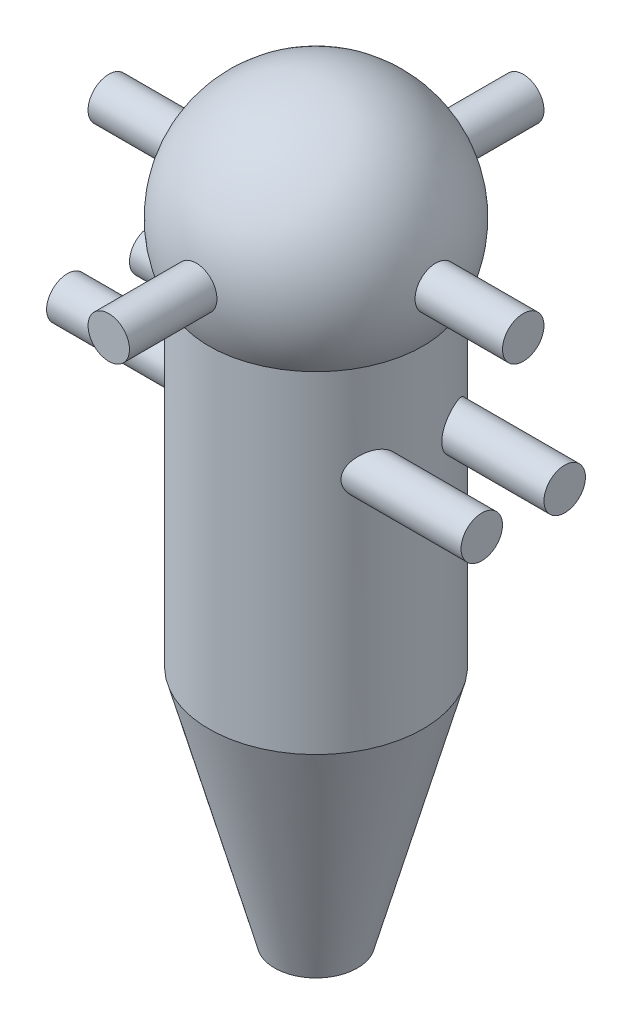
ISO-10303-21;
HEADER;
FILE_DESCRIPTION(('STEP AP214'),'2;1');
FILE_NAME('part.step','',(''),(''),'','','');
FILE_SCHEMA(('AUTOMOTIVE_DESIGN { 1 0 10303 214 1 1 1 1 }'));
ENDSEC;
DATA;
#1=APPLICATION_CONTEXT('core data for automotive mechanical design processes');
#2=APPLICATION_PROTOCOL_DEFINITION('international standard','automotive_design',2000,#1);
#3=PRODUCT_CONTEXT('',#1,'mechanical');
#4=PRODUCT('Part','Part','',(#3));
#5=PRODUCT_RELATED_PRODUCT_CATEGORY('part','',(#4));
#6=PRODUCT_DEFINITION_FORMATION('','',#4);
#7=PRODUCT_DEFINITION_CONTEXT('part definition',#1,'design');
#8=PRODUCT_DEFINITION('design','',#6,#7);
#9=PRODUCT_DEFINITION_SHAPE('','',#8);
#10=(LENGTH_UNIT() NAMED_UNIT(*) SI_UNIT(.MILLI.,.METRE.));
#11=(NAMED_UNIT(*) PLANE_ANGLE_UNIT() SI_UNIT($,.RADIAN.));
#12=(NAMED_UNIT(*) SI_UNIT($,.STERADIAN.) SOLID_ANGLE_UNIT());
#13=UNCERTAINTY_MEASURE_WITH_UNIT(LENGTH_MEASURE(1.E-05),#10,'distance_accuracy_value','');
#14=(GEOMETRIC_REPRESENTATION_CONTEXT(3) GLOBAL_UNCERTAINTY_ASSIGNED_CONTEXT((#13)) GLOBAL_UNIT_ASSIGNED_CONTEXT((#10,
#11,#12)) REPRESENTATION_CONTEXT('',''));
#15=CARTESIAN_POINT('',(0.,0.,0.));
#16=DIRECTION('',(0.,0.,1.));
#17=DIRECTION('',(1.,0.,0.));
#18=AXIS2_PLACEMENT_3D('',#15,#16,#17);
#19=CARTESIAN_POINT('',(0.,58.3812793036266,0.));
#20=DIRECTION('',(0.,-1.,0.));
#21=DIRECTION('',(-1.,0.,0.));
#22=AXIS2_PLACEMENT_3D('',#19,#20,#21);
#23=SPHERICAL_SURFACE('',#22,8.8);
#24=CARTESIAN_POINT('',(8.67121675429694,58.3812793036266,0.));
#25=DIRECTION('',(-1.,0.,0.));
#26=DIRECTION('',(0.,0.,1.));
#27=AXIS2_PLACEMENT_3D('',#24,#25,#26);
#28=CIRCLE('',#27,1.5);
#29=CARTESIAN_POINT('',(8.67121675429694,58.3812793036266,1.5));
#30=VERTEX_POINT('',#29);
#31=EDGE_CURVE('E73',#30,#30,#28,.T.);
#32=ORIENTED_EDGE('',*,*,#31,.T.);
#33=EDGE_LOOP('',(#32));
#34=FACE_BOUND('',#33,.T.);
#35=CARTESIAN_POINT('',(-8.67121675429694,58.3812793036266,0.));
#36=DIRECTION('',(1.,0.,0.));
#37=DIRECTION('',(0.,0.,-1.));
#38=AXIS2_PLACEMENT_3D('',#35,#36,#37);
#39=CIRCLE('',#38,1.5);
#40=CARTESIAN_POINT('',(-8.67121675429694,58.3812793036266,-1.5));
#41=VERTEX_POINT('',#40);
#42=EDGE_CURVE('E69',#41,#41,#39,.T.);
#43=ORIENTED_EDGE('',*,*,#42,.T.);
#44=EDGE_LOOP('',(#43));
#45=FACE_BOUND('',#44,.T.);
#46=CARTESIAN_POINT('',(0.,58.3812793036266,8.67121675429694));
#47=DIRECTION('',(0.,0.,-1.));
#48=DIRECTION('',(-1.,0.,0.));
#49=AXIS2_PLACEMENT_3D('',#46,#47,#48);
#50=CIRCLE('',#49,1.5);
#51=CARTESIAN_POINT('',(-1.5,58.3812793036266,8.67121675429694));
#52=VERTEX_POINT('',#51);
#53=EDGE_CURVE('E64',#52,#52,#50,.T.);
#54=ORIENTED_EDGE('',*,*,#53,.T.);
#55=EDGE_LOOP('',(#54));
#56=FACE_BOUND('',#55,.T.);
#57=CARTESIAN_POINT('',(0.,58.3812793036266,-8.67121675429694));
#58=DIRECTION('',(0.,0.,1.));
#59=DIRECTION('',(1.,0.,0.));
#60=AXIS2_PLACEMENT_3D('',#57,#58,#59);
#61=CIRCLE('',#60,1.5);
#62=CARTESIAN_POINT('',(1.5,58.3812793036266,-8.67121675429694));
#63=VERTEX_POINT('',#62);
#64=EDGE_CURVE('E60',#63,#63,#61,.T.);
#65=ORIENTED_EDGE('',*,*,#64,.T.);
#66=EDGE_LOOP('',(#65));
#67=FACE_BOUND('',#66,.T.);
#68=CARTESIAN_POINT('',(0.,54.2126464342076,0.));
#69=DIRECTION('',(0.,-1.,0.));
#70=DIRECTION('',(0.,0.,-1.));
#71=AXIS2_PLACEMENT_3D('',#68,#69,#70);
#72=CIRCLE('',#71,7.75);
#73=CARTESIAN_POINT('',(0.,54.2126464342076,-7.75));
#74=VERTEX_POINT('',#73);
#75=EDGE_CURVE('E56',#74,#74,#72,.T.);
#76=ORIENTED_EDGE('',*,*,#75,.F.);
#77=EDGE_LOOP('',(#76));
#78=FACE_BOUND('',#77,.T.);
#79=ADVANCED_FACE('F37',(#34,#45,#56,#67,#78),#23,.T.);
#80=CARTESIAN_POINT('',(-3.,12.850690899188,0.));
#81=DIRECTION('',(0.,1.,0.));
#82=DIRECTION('',(0.,0.,1.));
#83=AXIS2_PLACEMENT_3D('',#80,#81,#82);
#84=PLANE('',#83);
#85=CARTESIAN_POINT('',(0.,12.850690899188,0.));
#86=DIRECTION('',(0.,-1.,0.));
#87=DIRECTION('',(0.,0.,-1.));
#88=AXIS2_PLACEMENT_3D('',#85,#86,#87);
#89=CIRCLE('',#88,3.);
#90=CARTESIAN_POINT('',(0.,12.850690899188,-3.));
#91=VERTEX_POINT('',#90);
#92=EDGE_CURVE('E10',#91,#91,#89,.T.);
#93=ORIENTED_EDGE('',*,*,#92,.T.);
#94=EDGE_LOOP('',(#93));
#95=FACE_BOUND('',#94,.T.);
#96=ADVANCED_FACE('F138',(#95),#84,.F.);
#97=CARTESIAN_POINT('',(0.,30.2126464342076,0.));
#98=DIRECTION('',(0.,1.,0.));
#99=DIRECTION('',(0.,0.,1.));
#100=AXIS2_PLACEMENT_3D('',#97,#98,#99);
#101=CONICAL_SURFACE('',#100,7.75,0.26705179651545);
#102=ORIENTED_EDGE('',*,*,#92,.F.);
#103=EDGE_LOOP('',(#102));
#104=FACE_BOUND('',#103,.T.);
#105=CARTESIAN_POINT('',(0.,30.2126464342076,0.));
#106=DIRECTION('',(0.,-1.,0.));
#107=DIRECTION('',(0.,0.,-1.));
#108=AXIS2_PLACEMENT_3D('',#105,#106,#107);
#109=CIRCLE('',#108,7.75);
#110=CARTESIAN_POINT('',(0.,30.2126464342076,-7.75));
#111=VERTEX_POINT('',#110);
#112=EDGE_CURVE('E50',#111,#111,#109,.T.);
#113=ORIENTED_EDGE('',*,*,#112,.T.);
#114=EDGE_LOOP('',(#113));
#115=FACE_BOUND('',#114,.T.);
#116=ADVANCED_FACE('F145',(#104,#115),#101,.T.);
#117=CARTESIAN_POINT('',(0.,0.,0.));
#118=DIRECTION('',(0.,-1.,0.));
#119=DIRECTION('',(0.,0.,-1.));
#120=AXIS2_PLACEMENT_3D('',#117,#118,#119);
#121=CYLINDRICAL_SURFACE('',#120,7.75);
#122=CARTESIAN_POINT('',(-7.60345316287277,47.3812793036266,1.5));
#123=CARTESIAN_POINT('',(-7.60345328002533,47.4640685804779,1.50000066925797));
#124=CARTESIAN_POINT('',(-7.60210698301293,47.5468654018016,1.50687312577947));
#125=CARTESIAN_POINT('',(-7.59664895100796,47.7101144592104,1.53414941160526));
#126=CARTESIAN_POINT('',(-7.59253679704267,47.7905663381565,1.55455529094934));
#127=CARTESIAN_POINT('',(-7.58134521864554,47.9468239569576,1.6082448252582));
#128=CARTESIAN_POINT('',(-7.5742661122409,48.0226301937804,1.64152709997466));
#129=CARTESIAN_POINT('',(-7.55685772752841,48.1674626278467,1.71988500745346));
#130=CARTESIAN_POINT('',(-7.54652865933635,48.236489263025,1.76495987777189));
#131=CARTESIAN_POINT('',(-7.52230643844214,48.3659769362121,1.86549584764064));
#132=CARTESIAN_POINT('',(-7.50840758331268,48.4264240270221,1.92097352615021));
#133=CARTESIAN_POINT('',(-7.47683122514586,48.5370600532441,2.0404173739117));
#134=CARTESIAN_POINT('',(-7.45915368532381,48.587248888785,2.10438362579577));
#135=CARTESIAN_POINT('',(-7.41967292440302,48.676856268317,2.23963748457012));
#136=CARTESIAN_POINT('',(-7.39781647574696,48.7161177605791,2.31101342432072));
#137=CARTESIAN_POINT('',(-7.35026341631501,48.782284399224,2.45806819584621));
#138=CARTESIAN_POINT('',(-7.32456619914318,48.8091875916917,2.53374770591502));
#139=CARTESIAN_POINT('',(-7.26853161723786,48.8513069137014,2.69037967935951));
#140=CARTESIAN_POINT('',(-7.23804642944137,48.8659943881183,2.77142082352611));
#141=CARTESIAN_POINT('',(-7.17387224036911,48.8820211424174,2.93354195119539));
#142=CARTESIAN_POINT('',(-7.140182224291,48.8833561799791,3.01462193885747));
#143=CARTESIAN_POINT('',(-7.06778631091727,48.8728343888306,3.18083373138899));
#144=CARTESIAN_POINT('',(-7.02889372590327,48.8599944701016,3.26582162521267));
#145=CARTESIAN_POINT('',(-6.94943652871263,48.8203573057321,3.43166173083681));
#146=CARTESIAN_POINT('',(-6.90887125501881,48.7935544883171,3.5125122775097));
#147=CARTESIAN_POINT('',(-6.82418740500262,48.724189358498,3.67450002434581));
#148=CARTESIAN_POINT('',(-6.78003873313983,48.6805597784599,3.75516652166635));
#149=CARTESIAN_POINT('',(-6.69319746796007,48.5788684307846,3.90785548677903));
#150=CARTESIAN_POINT('',(-6.65050611758256,48.5207946771191,3.97987070161163));
#151=CARTESIAN_POINT('',(-6.56847373475519,48.3903141850942,4.11386591565933));
#152=CARTESIAN_POINT('',(-6.52917653589441,48.3177513218641,4.1757219064187));
#153=CARTESIAN_POINT('',(-6.45754531621388,48.1599103222314,4.28566423908569));
#154=CARTESIAN_POINT('',(-6.42519592718295,48.0746609704029,4.33378105076531));
#155=CARTESIAN_POINT('',(-6.3787048816219,47.9197327722216,4.4017960677829));
#156=CARTESIAN_POINT('',(-6.36200238630992,47.8526242328317,4.42582997440101));
#157=CARTESIAN_POINT('',(-6.33508295083136,47.7144681368498,4.46427823299967));
#158=CARTESIAN_POINT('',(-6.32485994174012,47.6434243342078,4.47870158722788));
#159=CARTESIAN_POINT('',(-6.31175976449767,47.4990426274873,4.4971461414478));
#160=CARTESIAN_POINT('',(-6.30891000127937,47.4256971874916,4.50112853513079));
#161=CARTESIAN_POINT('',(-6.31091312457772,47.2793139952784,4.49831946305322));
#162=CARTESIAN_POINT('',(-6.31576648835192,47.2062762624064,4.49152732974244));
#163=CARTESIAN_POINT('',(-6.33222095519158,47.0669272104632,4.46829495643839));
#164=CARTESIAN_POINT('',(-6.34342070326633,47.0004699981793,4.45242810411724));
#165=CARTESIAN_POINT('',(-6.37139697547562,46.8713975192211,4.41230039686693));
#166=CARTESIAN_POINT('',(-6.38817485644945,46.8087831916938,4.38803749960366));
#167=CARTESIAN_POINT('',(-6.42775797213072,46.6837286882629,4.3298677520872));
#168=CARTESIAN_POINT('',(-6.45093429546677,46.6216919696155,4.29535107643516));
#169=CARTESIAN_POINT('',(-6.50121763630588,46.5041774477017,4.21885824307949));
#170=CARTESIAN_POINT('',(-6.52832666303153,46.4487030235794,4.17687826988157));
#171=CARTESIAN_POINT('',(-6.59001343412974,46.3361737983882,4.07898203144253));
#172=CARTESIAN_POINT('',(-6.62508313060378,46.2803944571661,4.02190915478965));
#173=CARTESIAN_POINT('',(-6.69729566356806,46.1790301087283,3.90047831853521));
#174=CARTESIAN_POINT('',(-6.73443986214213,46.1334519001136,3.83611554331218));
#175=CARTESIAN_POINT('',(-6.81485523968047,46.0472144516678,3.69161464033366));
#176=CARTESIAN_POINT('',(-6.85823666947589,46.0082157924065,3.61054058966875));
#177=CARTESIAN_POINT('',(-6.94418765691388,45.945170566578,3.44233703002087));
#178=CARTESIAN_POINT('',(-6.9867569201874,45.9211293251357,3.35520537667588));
#179=CARTESIAN_POINT('',(-7.07113484541027,45.8884064232762,3.17362999454287));
#180=CARTESIAN_POINT('',(-7.11285656054529,45.8803282875003,3.07903488741719));
#181=CARTESIAN_POINT('',(-7.19238187002815,45.8824071849273,2.88838946958319));
#182=CARTESIAN_POINT('',(-7.23018707825168,45.8925566752023,2.79233977711774));
#183=CARTESIAN_POINT('',(-7.29854205975059,45.9304932607562,2.60822211055843));
#184=CARTESIAN_POINT('',(-7.32939878529323,45.9571295959663,2.52003235874351));
#185=CARTESIAN_POINT('',(-7.38608371946315,46.0268973555574,2.34870204222298));
#186=CARTESIAN_POINT('',(-7.41191477276872,46.0700194073107,2.2655586395815));
#187=CARTESIAN_POINT('',(-7.45637900145817,46.1675700374292,2.1143823835785));
#188=CARTESIAN_POINT('',(-7.47543334750808,46.2207522673678,2.04566739091039));
#189=CARTESIAN_POINT('',(-7.50922261309717,46.3388413152962,1.91792766306903));
#190=CARTESIAN_POINT('',(-7.52395863347369,46.4037451383602,1.85890045995353));
#191=CARTESIAN_POINT('',(-7.54876845045689,46.5399453458347,1.75536351555241));
#192=CARTESIAN_POINT('',(-7.55903416800439,46.6107771899139,1.71028725748712));
#193=CARTESIAN_POINT('',(-7.57622187363704,46.7592801407281,1.63246977338451));
#194=CARTESIAN_POINT('',(-7.58314476290148,46.83694939751,1.59972522341725));
#195=CARTESIAN_POINT('',(-7.59358891204075,46.991621722075,1.54936318152245));
#196=CARTESIAN_POINT('',(-7.5973027531452,47.0683371994723,1.53089762853405));
#197=CARTESIAN_POINT('',(-7.60223480405245,47.2237926309002,1.50621581172361));
#198=CARTESIAN_POINT('',(-7.60345305144067,47.3025325544231,1.4999993634213));
#199=CARTESIAN_POINT('',(-7.60345316287277,47.3812793036266,1.5));
#200=B_SPLINE_CURVE_WITH_KNOTS('',3,(#122,#123,#124,#125,#126,#127,#128,#129,#130,#131,#132,
#133,#134,#135,#136,#137,#138,#139,#140,#141,#142,#143,#144,#145,#146,#147,#148,#149,#150,#151,
#152,#153,#154,#155,#156,#157,#158,#159,#160,#161,#162,#163,#164,#165,#166,#167,#168,#169,#170,
#171,#172,#173,#174,#175,#176,#177,#178,#179,#180,#181,#182,#183,#184,#185,#186,#187,#188,#189,
#190,#191,#192,#193,#194,#195,#196,#197,#198,#199),.UNSPECIFIED.,.T.,.F.,(4,2,2,2,2,2,2,2,2,2,2,
2,2,2,2,2,2,2,2,2,2,2,2,2,2,2,2,2,2,2,2,2,2,2,2,2,2,2,4),(0.,0.248087307790253,
0.496212204375215,0.744310511288608,0.992392781502073,1.24087383359119,1.48935730470016,
1.74124661132996,1.99317572934683,2.25551116668689,2.51792995028403,2.79975951677722,
3.08170163117372,3.38566190959216,3.68987526605514,3.99756311223482,4.30456319418198,
4.52329675502121,4.74182513803466,4.9611645897282,5.18051763142138,5.38733855150124,
5.59420981608121,5.81740176988411,6.0407081569355,6.30120453101559,6.56187400077983,
6.8601828999012,7.15859794197507,7.46809451403005,7.77746304020527,8.06735267285986,
8.35707773901062,8.62258578741592,8.88802609291396,9.14055426510832,9.39301432121244,
9.62899129774804,9.86496472027448),.UNSPECIFIED.);
#201=CARTESIAN_POINT('',(-7.60345316287277,47.3812793036266,1.5));
#202=VERTEX_POINT('',#201);
#203=EDGE_CURVE('E40',#202,#202,#200,.T.);
#204=ORIENTED_EDGE('',*,*,#203,.T.);
#205=EDGE_LOOP('',(#204));
#206=FACE_BOUND('',#205,.T.);
#207=CARTESIAN_POINT('',(7.60345316287277,47.3812793036266,1.5));
#208=CARTESIAN_POINT('',(7.60345328002533,47.2984900267752,1.50000066925797));
#209=CARTESIAN_POINT('',(7.60210698301293,47.2156932054515,1.50687312577947));
#210=CARTESIAN_POINT('',(7.59664895100796,47.0524441480427,1.53414941160526));
#211=CARTESIAN_POINT('',(7.59253679704267,46.9719922690966,1.55455529094934));
#212=CARTESIAN_POINT('',(7.58134521864554,46.8157346502955,1.6082448252582));
#213=CARTESIAN_POINT('',(7.5742661122409,46.7399284134728,1.64152709997466));
#214=CARTESIAN_POINT('',(7.55685772752841,46.5950959794065,1.71988500745346));
#215=CARTESIAN_POINT('',(7.54652865933635,46.5260693442281,1.76495987777189));
#216=CARTESIAN_POINT('',(7.52230643844214,46.3965816710411,1.86549584764064));
#217=CARTESIAN_POINT('',(7.50840758331268,46.336134580231,1.92097352615021));
#218=CARTESIAN_POINT('',(7.47683122514586,46.225498554009,2.0404173739117));
#219=CARTESIAN_POINT('',(7.45915368532381,46.1753097184682,2.10438362579577));
#220=CARTESIAN_POINT('',(7.41967292440302,46.0857023389361,2.23963748457012));
#221=CARTESIAN_POINT('',(7.39781647574696,46.046440846674,2.31101342432072));
#222=CARTESIAN_POINT('',(7.35026341631501,45.9802742080292,2.45806819584621));
#223=CARTESIAN_POINT('',(7.32456619914318,45.9533710155615,2.53374770591502));
#224=CARTESIAN_POINT('',(7.26853161723786,45.9112516935518,2.69037967935951));
#225=CARTESIAN_POINT('',(7.23804642944137,45.8965642191348,2.77142082352611));
#226=CARTESIAN_POINT('',(7.17387224036911,45.8805374648358,2.93354195119539));
#227=CARTESIAN_POINT('',(7.140182224291,45.8792024272741,3.01462193885747));
#228=CARTESIAN_POINT('',(7.06778631091727,45.8897242184225,3.18083373138899));
#229=CARTESIAN_POINT('',(7.02889372590327,45.9025641371515,3.26582162521267));
#230=CARTESIAN_POINT('',(6.94943652871262,45.9422013015211,3.43166173083681));
#231=CARTESIAN_POINT('',(6.90887125501881,45.969004118936,3.5125122775097));
#232=CARTESIAN_POINT('',(6.82418740500262,46.0383692487552,3.67450002434581));
#233=CARTESIAN_POINT('',(6.78003873313983,46.0819988287932,3.75516652166635));
#234=CARTESIAN_POINT('',(6.69319746796007,46.1836901764685,3.90785548677903));
#235=CARTESIAN_POINT('',(6.65050611758256,46.241763930134,3.97987070161163));
#236=CARTESIAN_POINT('',(6.56847373475519,46.372244422159,4.11386591565933));
#237=CARTESIAN_POINT('',(6.52917653589441,46.4448072853891,4.1757219064187));
#238=CARTESIAN_POINT('',(6.45754531621388,46.6026482850218,4.28566423908569));
#239=CARTESIAN_POINT('',(6.42519592718295,46.6878976368503,4.33378105076531));
#240=CARTESIAN_POINT('',(6.3787048816219,46.8428258350315,4.4017960677829));
#241=CARTESIAN_POINT('',(6.36200238630992,46.9099343744214,4.42582997440101));
#242=CARTESIAN_POINT('',(6.33508295083136,47.0480904704033,4.46427823299967));
#243=CARTESIAN_POINT('',(6.32485994174012,47.1191342730453,4.47870158722788));
#244=CARTESIAN_POINT('',(6.31175976449767,47.2635159797658,4.4971461414478));
#245=CARTESIAN_POINT('',(6.30891000127937,47.3368614197615,4.50112853513079));
#246=CARTESIAN_POINT('',(6.31091312457772,47.4832446119748,4.49831946305322));
#247=CARTESIAN_POINT('',(6.31576648835192,47.5562823448467,4.49152732974245));
#248=CARTESIAN_POINT('',(6.33222095519158,47.6956313967899,4.46829495643839));
#249=CARTESIAN_POINT('',(6.34342070326633,47.7620886090738,4.45242810411724));
#250=CARTESIAN_POINT('',(6.37139697547562,47.8911610880321,4.41230039686693));
#251=CARTESIAN_POINT('',(6.38817485644945,47.9537754155593,4.38803749960366));
#252=CARTESIAN_POINT('',(6.42775797213072,48.0788299189902,4.3298677520872));
#253=CARTESIAN_POINT('',(6.45093429546677,48.1408666376376,4.29535107643516));
#254=CARTESIAN_POINT('',(6.50121763630588,48.2583811595514,4.21885824307949));
#255=CARTESIAN_POINT('',(6.52832666303153,48.3138555836737,4.17687826988157));
#256=CARTESIAN_POINT('',(6.59001343412974,48.4263848088649,4.07898203144253));
#257=CARTESIAN_POINT('',(6.62508313060378,48.482164150087,4.02190915478965));
#258=CARTESIAN_POINT('',(6.69729566356806,48.5835284985248,3.90047831853521));
#259=CARTESIAN_POINT('',(6.73443986214213,48.6291067071395,3.83611554331218));
#260=CARTESIAN_POINT('',(6.81485523968047,48.7153441555853,3.69161464033366));
#261=CARTESIAN_POINT('',(6.85823666947589,48.7543428148466,3.61054058966875));
#262=CARTESIAN_POINT('',(6.94418765691388,48.8173880406751,3.44233703002087));
#263=CARTESIAN_POINT('',(6.9867569201874,48.8414292821174,3.35520537667588));
#264=CARTESIAN_POINT('',(7.07113484541027,48.874152183977,3.17362999454287));
#265=CARTESIAN_POINT('',(7.11285656054529,48.8822303197528,3.07903488741719));
#266=CARTESIAN_POINT('',(7.19238187002815,48.8801514223258,2.88838946958319));
#267=CARTESIAN_POINT('',(7.23018707825168,48.8700019320508,2.79233977711774));
#268=CARTESIAN_POINT('',(7.29854205975059,48.8320653464969,2.60822211055843));
#269=CARTESIAN_POINT('',(7.32939878529323,48.8054290112868,2.52003235874351));
#270=CARTESIAN_POINT('',(7.38608371946315,48.7356612516958,2.34870204222298));
#271=CARTESIAN_POINT('',(7.41191477276872,48.6925391999424,2.2655586395815));
#272=CARTESIAN_POINT('',(7.45637900145817,48.5949885698239,2.1143823835785));
#273=CARTESIAN_POINT('',(7.47543334750808,48.5418063398853,2.04566739091039));
#274=CARTESIAN_POINT('',(7.50922261309717,48.423717291957,1.91792766306903));
#275=CARTESIAN_POINT('',(7.52395863347369,48.358813468893,1.85890045995353));
#276=CARTESIAN_POINT('',(7.54876845045689,48.2226132614184,1.75536351555241));
#277=CARTESIAN_POINT('',(7.55903416800439,48.1517814173392,1.71028725748712));
#278=CARTESIAN_POINT('',(7.57622187363704,48.0032784665251,1.63246977338451));
#279=CARTESIAN_POINT('',(7.58314476290148,47.9256092097432,1.59972522341725));
#280=CARTESIAN_POINT('',(7.59358891204075,47.7709368851781,1.54936318152245));
#281=CARTESIAN_POINT('',(7.5973027531452,47.6942214077808,1.53089762853405));
#282=CARTESIAN_POINT('',(7.60223480405245,47.5387659763529,1.50621581172361));
#283=CARTESIAN_POINT('',(7.60345305144067,47.46002605283,1.4999993634213));
#284=CARTESIAN_POINT('',(7.60345316287277,47.3812793036266,1.5));
#285=B_SPLINE_CURVE_WITH_KNOTS('',3,(#207,#208,#209,#210,#211,#212,#213,#214,#215,#216,#217,
#218,#219,#220,#221,#222,#223,#224,#225,#226,#227,#228,#229,#230,#231,#232,#233,#234,#235,#236,
#237,#238,#239,#240,#241,#242,#243,#244,#245,#246,#247,#248,#249,#250,#251,#252,#253,#254,#255,
#256,#257,#258,#259,#260,#261,#262,#263,#264,#265,#266,#267,#268,#269,#270,#271,#272,#273,#274,
#275,#276,#277,#278,#279,#280,#281,#282,#283,#284),.UNSPECIFIED.,.T.,.F.,(4,2,2,2,2,2,2,2,2,2,2,
2,2,2,2,2,2,2,2,2,2,2,2,2,2,2,2,2,2,2,2,2,2,2,2,2,2,2,4),(0.,0.248087307790253,
0.496212204375215,0.744310511288608,0.992392781502073,1.24087383359119,1.48935730470016,
1.74124661132996,1.99317572934683,2.25551116668689,2.51792995028403,2.79975951677723,
3.08170163117372,3.38566190959216,3.68987526605514,3.99756311223482,4.30456319418198,
4.52329675502121,4.74182513803466,4.96116458972819,5.18051763142138,5.38733855150124,
5.5942098160812,5.81740176988411,6.0407081569355,6.30120453101559,6.56187400077983,
6.8601828999012,7.15859794197507,7.46809451403005,7.77746304020527,8.06735267285986,
8.35707773901061,8.62258578741592,8.88802609291396,9.14055426510832,9.39301432121244,
9.62899129774804,9.86496472027448),.UNSPECIFIED.);
#286=CARTESIAN_POINT('',(7.60345316287277,47.3812793036266,1.5));
#287=VERTEX_POINT('',#286);
#288=EDGE_CURVE('E183',#287,#287,#285,.T.);
#289=ORIENTED_EDGE('',*,*,#288,.T.);
#290=EDGE_LOOP('',(#289));
#291=FACE_BOUND('',#290,.T.);
#292=CARTESIAN_POINT('',(-6.30971473206198,47.3812793036266,-4.5));
#293=CARTESIAN_POINT('',(-6.30971591662307,47.4554008427693,-4.49999882579149));
#294=CARTESIAN_POINT('',(-6.31366735017679,47.529531186231,-4.49447327001148));
#295=CARTESIAN_POINT('',(-6.32908724582261,47.6754046037166,-4.47273121170508));
#296=CARTESIAN_POINT('',(-6.34055975856861,47.7471463694254,-4.45650894818802));
#297=CARTESIAN_POINT('',(-6.36993048749451,47.8858997322618,-4.41442323525261));
#298=CARTESIAN_POINT('',(-6.38779667537618,47.9529329489567,-4.38860781719741));
#299=CARTESIAN_POINT('',(-6.42867560581689,48.0813581103598,-4.32850399022321));
#300=CARTESIAN_POINT('',(-6.45168988947836,48.142748358043,-4.29421304379873));
#301=CARTESIAN_POINT('',(-6.5037098783265,48.2640769719462,-4.21505431847808));
#302=CARTESIAN_POINT('',(-6.53306054395507,48.3234369546208,-4.16953075070768));
#303=CARTESIAN_POINT('',(-6.59480347055933,48.4339273924207,-4.07117227881535));
#304=CARTESIAN_POINT('',(-6.62719718908148,48.4850538717529,-4.01833386526607));
#305=CARTESIAN_POINT('',(-6.69950778218994,48.5867231189347,-3.89678185132226));
#306=CARTESIAN_POINT('',(-6.73975778283835,48.6356403623634,-3.82690250833966));
#307=CARTESIAN_POINT('',(-6.82097642753831,48.7208847422999,-3.68019331425105));
#308=CARTESIAN_POINT('',(-6.86194551283243,48.7572038428728,-3.60335906609362));
#309=CARTESIAN_POINT('',(-6.94699802491725,48.8192906316987,-3.43675077073802));
#310=CARTESIAN_POINT('',(-6.99100888347309,48.8437330808504,-3.34644040948532));
#311=CARTESIAN_POINT('',(-7.07648949731091,48.8754832230453,-3.16166909385077));
#312=CARTESIAN_POINT('',(-7.11795940325384,48.8827919329604,-3.06720838612721));
#313=CARTESIAN_POINT('',(-7.19608601927108,48.8792862319545,-2.87906010886018));
#314=CARTESIAN_POINT('',(-7.23282924340871,48.8688711463207,-2.78540204394432));
#315=CARTESIAN_POINT('',(-7.30150381892783,48.8300693628827,-2.60005638135044));
#316=CARTESIAN_POINT('',(-7.33343803952496,48.8016934341406,-2.5083676369331));
#317=CARTESIAN_POINT('',(-7.38938140796452,48.7302553882467,-2.33814091590719));
#318=CARTESIAN_POINT('',(-7.41383101246144,48.6886277274864,-2.2591452996919));
#319=CARTESIAN_POINT('',(-7.45795488477149,48.5912281057138,-2.10891882981252));
#320=CARTESIAN_POINT('',(-7.47763115205305,48.535462087104,-2.03768473189459));
#321=CARTESIAN_POINT('',(-7.5111287834975,48.4155974915646,-1.91036475717047));
#322=CARTESIAN_POINT('',(-7.5252585346841,48.3523296060815,-1.85357606928527));
#323=CARTESIAN_POINT('',(-7.5497306395796,48.2166330559536,-1.75124034851847));
#324=CARTESIAN_POINT('',(-7.56007367099741,48.1442060336435,-1.70569130455494));
#325=CARTESIAN_POINT('',(-7.57705253903319,47.9945550129955,-1.62858687783587));
#326=CARTESIAN_POINT('',(-7.58378738792129,47.9175316237684,-1.59666324731948));
#327=CARTESIAN_POINT('',(-7.59428293685731,47.7590780409489,-1.54597596613829));
#328=CARTESIAN_POINT('',(-7.59804377647962,47.677648054356,-1.52721169789104));
#329=CARTESIAN_POINT('',(-7.60276598908274,47.51327125969,-1.50352789032238));
#330=CARTESIAN_POINT('',(-7.60374565238872,47.4303379886862,-1.49851790358894));
#331=CARTESIAN_POINT('',(-7.60301114489566,47.2647923685893,-1.50223995361684));
#332=CARTESIAN_POINT('',(-7.60129700025323,47.1821800163879,-1.51097185694576));
#333=CARTESIAN_POINT('',(-7.59508470980463,47.01967049075,-1.54189285115277));
#334=CARTESIAN_POINT('',(-7.59058814326862,46.9397718041869,-1.5640743080778));
#335=CARTESIAN_POINT('',(-7.57859672345657,46.7849073007946,-1.62117772118145));
#336=CARTESIAN_POINT('',(-7.5711019453692,46.7099413603176,-1.65609935786196));
#337=CARTESIAN_POINT('',(-7.55281909986021,46.5670007659982,-1.7375730200195));
#338=CARTESIAN_POINT('',(-7.54202893042604,46.4990306116245,-1.78413246538769));
#339=CARTESIAN_POINT('',(-7.51686831752299,46.3719946504432,-1.88732687487437));
#340=CARTESIAN_POINT('',(-7.50249795735158,46.3129286365213,-1.94396160457043));
#341=CARTESIAN_POINT('',(-7.46985723938706,46.2048257683809,-2.06584885536649));
#342=CARTESIAN_POINT('',(-7.4515606930969,46.1558608181952,-2.13115806385436));
#343=CARTESIAN_POINT('',(-7.41107462009714,46.0695506073644,-2.2679408838658));
#344=CARTESIAN_POINT('',(-7.38888477391812,46.0322063009633,-2.33941500101351));
#345=CARTESIAN_POINT('',(-7.3400949438945,45.9688613165961,-2.48833402041423));
#346=CARTESIAN_POINT('',(-7.31339036058419,45.943201257558,-2.56588913196476));
#347=CARTESIAN_POINT('',(-7.25641017974417,45.9048885754011,-2.7228642389462));
#348=CARTESIAN_POINT('',(-7.22613365397723,45.8922393417294,-2.80228471481396));
#349=CARTESIAN_POINT('',(-7.16065532104752,45.8792960604606,-2.96575909217927));
#350=CARTESIAN_POINT('',(-7.12526582097807,45.8798017297771,-3.04980047869239));
#351=CARTESIAN_POINT('',(-7.05201305722484,45.894516106832,-3.21556173099121));
#352=CARTESIAN_POINT('',(-7.01414897732688,45.9087293573549,-3.29728081790823));
#353=CARTESIAN_POINT('',(-6.93380153807954,45.9518222717725,-3.46324642997118));
#354=CARTESIAN_POINT('',(-6.89119487896244,45.9818157683365,-3.54714474115571));
#355=CARTESIAN_POINT('',(-6.80580593058054,46.0560889086787,-3.70834758170039));
#356=CARTESIAN_POINT('',(-6.76302352602758,46.1003802361852,-3.78564665282633));
#357=CARTESIAN_POINT('',(-6.67693197147081,46.2050785933607,-3.93559771874304));
#358=CARTESIAN_POINT('',(-6.6337095150036,46.2661991547258,-4.00780423149301));
#359=CARTESIAN_POINT('',(-6.55165944577438,46.4024451904783,-4.14057262398873));
#360=CARTESIAN_POINT('',(-6.5128267157477,46.4775540818737,-4.20114812122748));
#361=CARTESIAN_POINT('',(-6.4510863805088,46.6209716276596,-4.29515577603164));
#362=CARTESIAN_POINT('',(-6.4265905806385,46.6866180524196,-4.33161523313795));
#363=CARTESIAN_POINT('',(-6.38356100930223,46.8242393888847,-4.39478243353836));
#364=CARTESIAN_POINT('',(-6.36501938513038,46.8962058044786,-4.42150302733386));
#365=CARTESIAN_POINT('',(-6.33708642689791,47.0364325763211,-4.46143089619427));
#366=CARTESIAN_POINT('',(-6.32689894242332,47.1041954928323,-4.47582236201301));
#367=CARTESIAN_POINT('',(-6.31321341077132,47.2417297926719,-4.49510622646124));
#368=CARTESIAN_POINT('',(-6.30971361690594,47.3115006467345,-4.50000110541003));
#369=CARTESIAN_POINT('',(-6.30971473206198,47.3812793036266,-4.5));
#370=B_SPLINE_CURVE_WITH_KNOTS('',3,(#292,#293,#294,#295,#296,#297,#298,#299,#300,#301,#302,
#303,#304,#305,#306,#307,#308,#309,#310,#311,#312,#313,#314,#315,#316,#317,#318,#319,#320,#321,
#322,#323,#324,#325,#326,#327,#328,#329,#330,#331,#332,#333,#334,#335,#336,#337,#338,#339,#340,
#341,#342,#343,#344,#345,#346,#347,#348,#349,#350,#351,#352,#353,#354,#355,#356,#357,#358,#359,
#360,#361,#362,#363,#364,#365,#366,#367,#368,#369),.UNSPECIFIED.,.T.,.F.,(4,2,2,2,2,2,2,2,2,2,2,
2,2,2,2,2,2,2,2,2,2,2,2,2,2,2,2,2,2,2,2,2,2,2,2,2,2,2,4),(0.,0.222082095840035,
0.444283897580533,0.66538784053335,0.886558060595244,1.12673933239176,1.3670362373652,
1.64883051276692,1.93080420621701,2.23948578101497,2.54814903537849,2.84994966370813,
3.15156950793126,3.42784404461994,3.70400265408119,3.96127478660256,4.21850085261816,
4.46825062814896,4.71798868188035,4.96608049266337,5.21416989451402,5.4621186127161,
5.71006111328982,5.95816209902684,6.20625731293345,6.45606188306793,6.70588696081202,
6.96259019936483,7.2193602946927,7.49177457135675,7.76427915897658,8.05927847998907,
8.35451947780868,8.66499209255793,8.97509896204028,9.21112022659879,9.44682892212641,
9.65595355108399,9.86502355349783),.UNSPECIFIED.);
#371=CARTESIAN_POINT('',(-6.30971473206198,47.3812793036266,-4.5));
#372=VERTEX_POINT('',#371);
#373=EDGE_CURVE('E87',#372,#372,#370,.T.);
#374=ORIENTED_EDGE('',*,*,#373,.T.);
#375=EDGE_LOOP('',(#374));
#376=FACE_BOUND('',#375,.T.);
#377=CARTESIAN_POINT('',(6.30971473206198,47.3812793036266,-4.5));
#378=CARTESIAN_POINT('',(6.30971591662307,47.3071577644838,-4.49999882579149));
#379=CARTESIAN_POINT('',(6.31366735017679,47.2330274210221,-4.49447327001148));
#380=CARTESIAN_POINT('',(6.32908724582261,47.0871540035365,-4.47273121170508));
#381=CARTESIAN_POINT('',(6.34055975856861,47.0154122378278,-4.45650894818802));
#382=CARTESIAN_POINT('',(6.36993048749451,46.8766588749913,-4.41442323525261));
#383=CARTESIAN_POINT('',(6.38779667537618,46.8096256582964,-4.38860781719741));
#384=CARTESIAN_POINT('',(6.42867560581689,46.6812004968933,-4.32850399022321));
#385=CARTESIAN_POINT('',(6.45168988947836,46.6198102492101,-4.29421304379873));
#386=CARTESIAN_POINT('',(6.5037098783265,46.498481635307,-4.21505431847808));
#387=CARTESIAN_POINT('',(6.53306054395507,46.4391216526323,-4.16953075070768));
#388=CARTESIAN_POINT('',(6.59480347055933,46.3286312148324,-4.07117227881535));
#389=CARTESIAN_POINT('',(6.62719718908148,46.2775047355003,-4.01833386526607));
#390=CARTESIAN_POINT('',(6.69950778218994,46.1758354883184,-3.89678185132226));
#391=CARTESIAN_POINT('',(6.73975778283835,46.1269182448898,-3.82690250833966));
#392=CARTESIAN_POINT('',(6.82097642753831,46.0416738649532,-3.68019331425105));
#393=CARTESIAN_POINT('',(6.86194551283243,46.0053547643803,-3.60335906609362));
#394=CARTESIAN_POINT('',(6.94699802491725,45.9432679755544,-3.43675077073802));
#395=CARTESIAN_POINT('',(6.99100888347309,45.9188255264028,-3.34644040948532));
#396=CARTESIAN_POINT('',(7.07648949731091,45.8870753842079,-3.16166909385077));
#397=CARTESIAN_POINT('',(7.11795940325384,45.8797666742927,-3.06720838612721));
#398=CARTESIAN_POINT('',(7.19608601927108,45.8832723752986,-2.87906010886018));
#399=CARTESIAN_POINT('',(7.23282924340871,45.8936874609324,-2.78540204394432));
#400=CARTESIAN_POINT('',(7.30150381892783,45.9324892443705,-2.60005638135044));
#401=CARTESIAN_POINT('',(7.33343803952496,45.9608651731125,-2.5083676369331));
#402=CARTESIAN_POINT('',(7.38938140796452,46.0323032190064,-2.33814091590719));
#403=CARTESIAN_POINT('',(7.41383101246144,46.0739308797667,-2.2591452996919));
#404=CARTESIAN_POINT('',(7.45795488477149,46.1713305015393,-2.10891882981252));
#405=CARTESIAN_POINT('',(7.47763115205305,46.2270965201492,-2.03768473189459));
#406=CARTESIAN_POINT('',(7.5111287834975,46.3469611156885,-1.91036475717047));
#407=CARTESIAN_POINT('',(7.5252585346841,46.4102290011716,-1.85357606928527));
#408=CARTESIAN_POINT('',(7.5497306395796,46.5459255512995,-1.75124034851847));
#409=CARTESIAN_POINT('',(7.56007367099741,46.6183525736096,-1.70569130455494));
#410=CARTESIAN_POINT('',(7.57705253903319,46.7680035942577,-1.62858687783587));
#411=CARTESIAN_POINT('',(7.58378738792129,46.8450269834848,-1.59666324731948));
#412=CARTESIAN_POINT('',(7.59428293685731,47.0034805663042,-1.54597596613829));
#413=CARTESIAN_POINT('',(7.59804377647962,47.0849105528971,-1.52721169789104));
#414=CARTESIAN_POINT('',(7.60276598908274,47.2492873475631,-1.50352789032238));
#415=CARTESIAN_POINT('',(7.60374565238872,47.3322206185669,-1.49851790358894));
#416=CARTESIAN_POINT('',(7.60301114489566,47.4977662386638,-1.50223995361684));
#417=CARTESIAN_POINT('',(7.60129700025323,47.5803785908652,-1.51097185694576));
#418=CARTESIAN_POINT('',(7.59508470980463,47.7428881165031,-1.54189285115277));
#419=CARTESIAN_POINT('',(7.59058814326862,47.8227868030662,-1.5640743080778));
#420=CARTESIAN_POINT('',(7.57859672345658,47.9776513064585,-1.62117772118145));
#421=CARTESIAN_POINT('',(7.5711019453692,48.0526172469355,-1.65609935786196));
#422=CARTESIAN_POINT('',(7.55281909986021,48.195557841255,-1.7375730200195));
#423=CARTESIAN_POINT('',(7.54202893042604,48.2635279956286,-1.78413246538769));
#424=CARTESIAN_POINT('',(7.51686831752299,48.3905639568099,-1.88732687487437));
#425=CARTESIAN_POINT('',(7.50249795735158,48.4496299707318,-1.94396160457043));
#426=CARTESIAN_POINT('',(7.46985723938706,48.5577328388723,-2.06584885536649));
#427=CARTESIAN_POINT('',(7.4515606930969,48.6066977890579,-2.13115806385436));
#428=CARTESIAN_POINT('',(7.41107462009714,48.6930079998887,-2.2679408838658));
#429=CARTESIAN_POINT('',(7.38888477391812,48.7303523062898,-2.33941500101351));
#430=CARTESIAN_POINT('',(7.3400949438945,48.793697290657,-2.48833402041423));
#431=CARTESIAN_POINT('',(7.31339036058419,48.8193573496952,-2.56588913196476));
#432=CARTESIAN_POINT('',(7.25641017974417,48.857670031852,-2.7228642389462));
#433=CARTESIAN_POINT('',(7.22613365397723,48.8703192655237,-2.80228471481396));
#434=CARTESIAN_POINT('',(7.16065532104752,48.8832625467925,-2.96575909217927));
#435=CARTESIAN_POINT('',(7.12526582097807,48.882756877476,-3.04980047869239));
#436=CARTESIAN_POINT('',(7.05201305722484,48.8680425004211,-3.21556173099121));
#437=CARTESIAN_POINT('',(7.01414897732688,48.8538292498982,-3.29728081790823));
#438=CARTESIAN_POINT('',(6.93380153807954,48.8107363354806,-3.46324642997118));
#439=CARTESIAN_POINT('',(6.89119487896244,48.7807428389166,-3.54714474115572));
#440=CARTESIAN_POINT('',(6.80580593058054,48.7064696985745,-3.70834758170039));
#441=CARTESIAN_POINT('',(6.76302352602758,48.6621783710679,-3.78564665282633));
#442=CARTESIAN_POINT('',(6.67693197147081,48.5574800138925,-3.93559771874304));
#443=CARTESIAN_POINT('',(6.6337095150036,48.4963594525274,-4.00780423149301));
#444=CARTESIAN_POINT('',(6.55165944577438,48.3601134167748,-4.14057262398874));
#445=CARTESIAN_POINT('',(6.5128267157477,48.2850045253794,-4.20114812122748));
#446=CARTESIAN_POINT('',(6.4510863805088,48.1415869795936,-4.29515577603164));
#447=CARTESIAN_POINT('',(6.4265905806385,48.0759405548335,-4.33161523313795));
#448=CARTESIAN_POINT('',(6.38356100930223,47.9383192183684,-4.39478243353836));
#449=CARTESIAN_POINT('',(6.36501938513038,47.8663528027745,-4.42150302733386));
#450=CARTESIAN_POINT('',(6.3370864268979,47.726126030932,-4.46143089619427));
#451=CARTESIAN_POINT('',(6.32689894242332,47.6583631144208,-4.47582236201302));
#452=CARTESIAN_POINT('',(6.31321341077132,47.5208288145812,-4.49510622646124));
#453=CARTESIAN_POINT('',(6.30971361690594,47.4510579605186,-4.50000110541003));
#454=CARTESIAN_POINT('',(6.30971473206198,47.3812793036266,-4.5));
#455=B_SPLINE_CURVE_WITH_KNOTS('',3,(#377,#378,#379,#380,#381,#382,#383,#384,#385,#386,#387,
#388,#389,#390,#391,#392,#393,#394,#395,#396,#397,#398,#399,#400,#401,#402,#403,#404,#405,#406,
#407,#408,#409,#410,#411,#412,#413,#414,#415,#416,#417,#418,#419,#420,#421,#422,#423,#424,#425,
#426,#427,#428,#429,#430,#431,#432,#433,#434,#435,#436,#437,#438,#439,#440,#441,#442,#443,#444,
#445,#446,#447,#448,#449,#450,#451,#452,#453,#454),.UNSPECIFIED.,.T.,.F.,(4,2,2,2,2,2,2,2,2,2,2,
2,2,2,2,2,2,2,2,2,2,2,2,2,2,2,2,2,2,2,2,2,2,2,2,2,2,2,4),(0.,0.222082095840035,
0.444283897580533,0.66538784053335,0.886558060595244,1.12673933239176,1.3670362373652,
1.64883051276693,1.93080420621701,2.23948578101497,2.54814903537849,2.84994966370813,
3.15156950793126,3.42784404461994,3.70400265408118,3.96127478660256,4.21850085261816,
4.46825062814896,4.71798868188034,4.96608049266337,5.21416989451402,5.46211861271609,
5.71006111328981,5.95816209902684,6.20625731293345,6.45606188306793,6.70588696081201,
6.96259019936483,7.21936029469269,7.49177457135675,7.76427915897658,8.05927847998908,
8.35451947780868,8.66499209255793,8.97509896204028,9.21112022659881,9.44682892212641,
9.65595355108401,9.86502355349783),.UNSPECIFIED.);
#456=CARTESIAN_POINT('',(6.30971473206198,47.3812793036266,-4.5));
#457=VERTEX_POINT('',#456);
#458=EDGE_CURVE('E79',#457,#457,#455,.T.);
#459=ORIENTED_EDGE('',*,*,#458,.T.);
#460=EDGE_LOOP('',(#459));
#461=FACE_BOUND('',#460,.T.);
#462=ORIENTED_EDGE('',*,*,#112,.F.);
#463=EDGE_LOOP('',(#462));
#464=FACE_BOUND('',#463,.T.);
#465=ORIENTED_EDGE('',*,*,#75,.T.);
#466=EDGE_LOOP('',(#465));
#467=FACE_BOUND('',#466,.T.);
#468=ADVANCED_FACE('F92',(#206,#291,#376,#461,#464,#467),#121,.T.);
#469=CARTESIAN_POINT('',(0.,58.3812793036266,-15.));
#470=DIRECTION('',(0.,0.,1.));
#471=DIRECTION('',(1.,0.,0.));
#472=AXIS2_PLACEMENT_3D('',#469,#470,#471);
#473=PLANE('',#472);
#474=CARTESIAN_POINT('',(0.,58.3812793036266,-15.));
#475=DIRECTION('',(0.,0.,1.));
#476=DIRECTION('',(1.,0.,0.));
#477=AXIS2_PLACEMENT_3D('',#474,#475,#476);
#478=CIRCLE('',#477,1.5);
#479=CARTESIAN_POINT('',(1.5,58.3812793036266,-15.));
#480=VERTEX_POINT('',#479);
#481=EDGE_CURVE('E65',#480,#480,#478,.T.);
#482=ORIENTED_EDGE('',*,*,#481,.F.);
#483=EDGE_LOOP('',(#482));
#484=FACE_BOUND('',#483,.T.);
#485=ADVANCED_FACE('F125',(#484),#473,.F.);
#486=CARTESIAN_POINT('',(0.,58.3812793036266,-15.));
#487=DIRECTION('',(0.,0.,1.));
#488=DIRECTION('',(1.,0.,0.));
#489=AXIS2_PLACEMENT_3D('',#486,#487,#488);
#490=CYLINDRICAL_SURFACE('',#489,1.5);
#491=ORIENTED_EDGE('',*,*,#481,.T.);
#492=EDGE_LOOP('',(#491));
#493=FACE_BOUND('',#492,.T.);
#494=ORIENTED_EDGE('',*,*,#64,.F.);
#495=EDGE_LOOP('',(#494));
#496=FACE_BOUND('',#495,.T.);
#497=ADVANCED_FACE('F127',(#493,#496),#490,.T.);
#498=CARTESIAN_POINT('',(0.,58.3812793036266,15.));
#499=DIRECTION('',(0.,0.,1.));
#500=DIRECTION('',(1.,0.,0.));
#501=AXIS2_PLACEMENT_3D('',#498,#499,#500);
#502=CIRCLE('',#501,1.5);
#503=CARTESIAN_POINT('',(1.5,58.3812793036266,15.));
#504=VERTEX_POINT('',#503);
#505=EDGE_CURVE('E78',#504,#504,#502,.T.);
#506=ORIENTED_EDGE('',*,*,#505,.F.);
#507=EDGE_LOOP('',(#506));
#508=FACE_BOUND('',#507,.T.);
#509=ORIENTED_EDGE('',*,*,#53,.F.);
#510=EDGE_LOOP('',(#509));
#511=FACE_BOUND('',#510,.T.);
#512=ADVANCED_FACE('F123',(#508,#511),#490,.T.);
#513=CARTESIAN_POINT('',(0.,58.3812793036266,15.));
#514=DIRECTION('',(0.,0.,1.));
#515=DIRECTION('',(1.,0.,0.));
#516=AXIS2_PLACEMENT_3D('',#513,#514,#515);
#517=PLANE('',#516);
#518=ORIENTED_EDGE('',*,*,#505,.T.);
#519=EDGE_LOOP('',(#518));
#520=FACE_BOUND('',#519,.T.);
#521=ADVANCED_FACE('F116',(#520),#517,.T.);
#522=CARTESIAN_POINT('',(-15.,58.3812793036266,0.));
#523=DIRECTION('',(1.,0.,0.));
#524=DIRECTION('',(0.,0.,-1.));
#525=AXIS2_PLACEMENT_3D('',#522,#523,#524);
#526=PLANE('',#525);
#527=CARTESIAN_POINT('',(-15.,58.3812793036266,0.));
#528=DIRECTION('',(1.,0.,0.));
#529=DIRECTION('',(0.,0.,-1.));
#530=AXIS2_PLACEMENT_3D('',#527,#528,#529);
#531=CIRCLE('',#530,1.5);
#532=CARTESIAN_POINT('',(-15.,58.3812793036266,-1.5));
#533=VERTEX_POINT('',#532);
#534=EDGE_CURVE('E74',#533,#533,#531,.T.);
#535=ORIENTED_EDGE('',*,*,#534,.F.);
#536=EDGE_LOOP('',(#535));
#537=FACE_BOUND('',#536,.T.);
#538=ADVANCED_FACE('F112',(#537),#526,.F.);
#539=CARTESIAN_POINT('',(-15.,58.3812793036266,0.));
#540=DIRECTION('',(1.,0.,0.));
#541=DIRECTION('',(0.,0.,-1.));
#542=AXIS2_PLACEMENT_3D('',#539,#540,#541);
#543=CYLINDRICAL_SURFACE('',#542,1.5);
#544=ORIENTED_EDGE('',*,*,#534,.T.);
#545=EDGE_LOOP('',(#544));
#546=FACE_BOUND('',#545,.T.);
#547=ORIENTED_EDGE('',*,*,#42,.F.);
#548=EDGE_LOOP('',(#547));
#549=FACE_BOUND('',#548,.T.);
#550=ADVANCED_FACE('F115',(#546,#549),#543,.T.);
#551=CARTESIAN_POINT('',(15.,58.3812793036266,0.));
#552=DIRECTION('',(1.,0.,0.));
#553=DIRECTION('',(0.,0.,-1.));
#554=AXIS2_PLACEMENT_3D('',#551,#552,#553);
#555=CIRCLE('',#554,1.5);
#556=CARTESIAN_POINT('',(15.,58.3812793036266,-1.5));
#557=VERTEX_POINT('',#556);
#558=EDGE_CURVE('E168',#557,#557,#555,.T.);
#559=ORIENTED_EDGE('',*,*,#558,.F.);
#560=EDGE_LOOP('',(#559));
#561=FACE_BOUND('',#560,.T.);
#562=ORIENTED_EDGE('',*,*,#31,.F.);
#563=EDGE_LOOP('',(#562));
#564=FACE_BOUND('',#563,.T.);
#565=ADVANCED_FACE('F110',(#561,#564),#543,.T.);
#566=CARTESIAN_POINT('',(15.,58.3812793036266,0.));
#567=DIRECTION('',(1.,0.,0.));
#568=DIRECTION('',(0.,0.,-1.));
#569=AXIS2_PLACEMENT_3D('',#566,#567,#568);
#570=PLANE('',#569);
#571=ORIENTED_EDGE('',*,*,#558,.T.);
#572=EDGE_LOOP('',(#571));
#573=FACE_BOUND('',#572,.T.);
#574=ADVANCED_FACE('F105',(#573),#570,.T.);
#575=CARTESIAN_POINT('',(15.,47.3812793036266,-3.));
#576=DIRECTION('',(1.,0.,0.));
#577=DIRECTION('',(0.,0.,-1.));
#578=AXIS2_PLACEMENT_3D('',#575,#576,#577);
#579=PLANE('',#578);
#580=CARTESIAN_POINT('',(15.,47.3812793036266,-3.));
#581=DIRECTION('',(1.,0.,0.));
#582=DIRECTION('',(0.,0.,-1.));
#583=AXIS2_PLACEMENT_3D('',#580,#581,#582);
#584=CIRCLE('',#583,1.5);
#585=CARTESIAN_POINT('',(15.,47.3812793036266,-4.5));
#586=VERTEX_POINT('',#585);
#587=EDGE_CURVE('E175',#586,#586,#584,.T.);
#588=ORIENTED_EDGE('',*,*,#587,.T.);
#589=EDGE_LOOP('',(#588));
#590=FACE_BOUND('',#589,.T.);
#591=ADVANCED_FACE('F109',(#590),#579,.T.);
#592=CARTESIAN_POINT('',(-15.,47.3812793036266,-3.));
#593=DIRECTION('',(1.,0.,0.));
#594=DIRECTION('',(0.,0.,-1.));
#595=AXIS2_PLACEMENT_3D('',#592,#593,#594);
#596=CYLINDRICAL_SURFACE('',#595,1.5);
#597=ORIENTED_EDGE('',*,*,#587,.F.);
#598=EDGE_LOOP('',(#597));
#599=FACE_BOUND('',#598,.T.);
#600=ORIENTED_EDGE('',*,*,#458,.F.);
#601=EDGE_LOOP('',(#600));
#602=FACE_BOUND('',#601,.T.);
#603=ADVANCED_FACE('F102',(#599,#602),#596,.T.);
#604=CARTESIAN_POINT('',(-15.,47.3812793036266,-3.));
#605=DIRECTION('',(1.,0.,0.));
#606=DIRECTION('',(0.,0.,-1.));
#607=AXIS2_PLACEMENT_3D('',#604,#605,#606);
#608=CIRCLE('',#607,1.5);
#609=CARTESIAN_POINT('',(-15.,47.3812793036266,-4.5));
#610=VERTEX_POINT('',#609);
#611=EDGE_CURVE('E88',#610,#610,#608,.T.);
#612=ORIENTED_EDGE('',*,*,#611,.T.);
#613=EDGE_LOOP('',(#612));
#614=FACE_BOUND('',#613,.T.);
#615=ORIENTED_EDGE('',*,*,#373,.F.);
#616=EDGE_LOOP('',(#615));
#617=FACE_BOUND('',#616,.T.);
#618=ADVANCED_FACE('F96',(#614,#617),#596,.T.);
#619=CARTESIAN_POINT('',(-15.,47.3812793036266,-3.));
#620=DIRECTION('',(1.,0.,0.));
#621=DIRECTION('',(0.,0.,-1.));
#622=AXIS2_PLACEMENT_3D('',#619,#620,#621);
#623=PLANE('',#622);
#624=ORIENTED_EDGE('',*,*,#611,.F.);
#625=EDGE_LOOP('',(#624));
#626=FACE_BOUND('',#625,.T.);
#627=ADVANCED_FACE('F101',(#626),#623,.F.);
#628=CARTESIAN_POINT('',(15.,47.3812793036266,3.));
#629=DIRECTION('',(-1.,0.,0.));
#630=DIRECTION('',(0.,0.,1.));
#631=AXIS2_PLACEMENT_3D('',#628,#629,#630);
#632=PLANE('',#631);
#633=CARTESIAN_POINT('',(15.,47.3812793036266,3.));
#634=DIRECTION('',(1.,0.,0.));
#635=DIRECTION('',(0.,0.,1.));
#636=AXIS2_PLACEMENT_3D('',#633,#634,#635);
#637=CIRCLE('',#636,1.5);
#638=CARTESIAN_POINT('',(15.,47.3812793036266,4.5));
#639=VERTEX_POINT('',#638);
#640=EDGE_CURVE('E184',#639,#639,#637,.T.);
#641=ORIENTED_EDGE('',*,*,#640,.T.);
#642=EDGE_LOOP('',(#641));
#643=FACE_BOUND('',#642,.T.);
#644=ADVANCED_FACE('F189',(#643),#632,.F.);
#645=CARTESIAN_POINT('',(-15.,47.3812793036266,3.));
#646=DIRECTION('',(1.,0.,0.));
#647=DIRECTION('',(0.,0.,-1.));
#648=AXIS2_PLACEMENT_3D('',#645,#646,#647);
#649=CYLINDRICAL_SURFACE('',#648,1.5);
#650=ORIENTED_EDGE('',*,*,#640,.F.);
#651=EDGE_LOOP('',(#650));
#652=FACE_BOUND('',#651,.T.);
#653=ORIENTED_EDGE('',*,*,#288,.F.);
#654=EDGE_LOOP('',(#653));
#655=FACE_BOUND('',#654,.T.);
#656=ADVANCED_FACE('F191',(#652,#655),#649,.T.);
#657=CARTESIAN_POINT('',(-15.,47.3812793036266,3.));
#658=DIRECTION('',(1.,0.,0.));
#659=DIRECTION('',(0.,0.,1.));
#660=AXIS2_PLACEMENT_3D('',#657,#658,#659);
#661=CIRCLE('',#660,1.5);
#662=CARTESIAN_POINT('',(-15.,47.3812793036266,4.5));
#663=VERTEX_POINT('',#662);
#664=EDGE_CURVE('E179',#663,#663,#661,.T.);
#665=ORIENTED_EDGE('',*,*,#664,.T.);
#666=EDGE_LOOP('',(#665));
#667=FACE_BOUND('',#666,.T.);
#668=ORIENTED_EDGE('',*,*,#203,.F.);
#669=EDGE_LOOP('',(#668));
#670=FACE_BOUND('',#669,.T.);
#671=ADVANCED_FACE('F194',(#667,#670),#649,.T.);
#672=CARTESIAN_POINT('',(-15.,47.3812793036266,3.));
#673=DIRECTION('',(-1.,0.,0.));
#674=DIRECTION('',(0.,0.,1.));
#675=AXIS2_PLACEMENT_3D('',#672,#673,#674);
#676=PLANE('',#675);
#677=ORIENTED_EDGE('',*,*,#664,.F.);
#678=EDGE_LOOP('',(#677));
#679=FACE_BOUND('',#678,.T.);
#680=ADVANCED_FACE('F207',(#679),#676,.T.);
#681=CLOSED_SHELL('',(#79,#96,#116,#468,#485,#497,#512,#521,#538,#550,#565,#574,#591,#603,#618,
#627,#644,#656,#671,#680));
#682=MANIFOLD_SOLID_BREP('B2',#681);
#683=ADVANCED_BREP_SHAPE_REPRESENTATION('',(#18,#682),#14);
#684=SHAPE_DEFINITION_REPRESENTATION(#9,#683);
ENDSEC;
END-ISO-10303-21;
